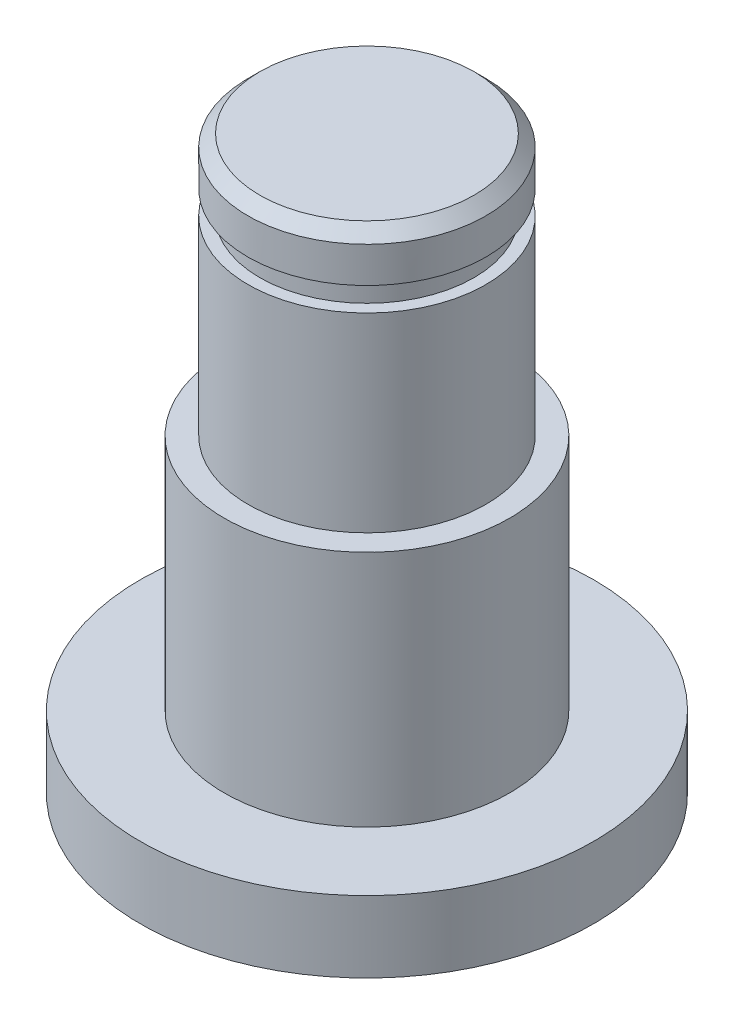
ISO-10303-21;
HEADER;
FILE_DESCRIPTION(('STEP AP214'),'2;1');
FILE_NAME('part.step','',(''),(''),'','','');
FILE_SCHEMA(('AUTOMOTIVE_DESIGN { 1 0 10303 214 1 1 1 1 }'));
ENDSEC;
DATA;
#1=APPLICATION_CONTEXT('core data for automotive mechanical design processes');
#2=APPLICATION_PROTOCOL_DEFINITION('international standard','automotive_design',2000,#1);
#3=PRODUCT_CONTEXT('',#1,'mechanical');
#4=PRODUCT('Part','Part','',(#3));
#5=PRODUCT_RELATED_PRODUCT_CATEGORY('part','',(#4));
#6=PRODUCT_DEFINITION_FORMATION('','',#4);
#7=PRODUCT_DEFINITION_CONTEXT('part definition',#1,'design');
#8=PRODUCT_DEFINITION('design','',#6,#7);
#9=PRODUCT_DEFINITION_SHAPE('','',#8);
#10=(LENGTH_UNIT() NAMED_UNIT(*) SI_UNIT(.MILLI.,.METRE.));
#11=(NAMED_UNIT(*) PLANE_ANGLE_UNIT() SI_UNIT($,.RADIAN.));
#12=(NAMED_UNIT(*) SI_UNIT($,.STERADIAN.) SOLID_ANGLE_UNIT());
#13=UNCERTAINTY_MEASURE_WITH_UNIT(LENGTH_MEASURE(1.E-05),#10,'distance_accuracy_value','');
#14=(GEOMETRIC_REPRESENTATION_CONTEXT(3) GLOBAL_UNCERTAINTY_ASSIGNED_CONTEXT((#13)) GLOBAL_UNIT_ASSIGNED_CONTEXT((#10,
#11,#12)) REPRESENTATION_CONTEXT('',''));
#15=CARTESIAN_POINT('',(0.,0.,0.));
#16=DIRECTION('',(0.,0.,1.));
#17=DIRECTION('',(1.,0.,0.));
#18=AXIS2_PLACEMENT_3D('',#15,#16,#17);
#19=CARTESIAN_POINT('',(0.,0.,0.));
#20=DIRECTION('',(0.,1.,0.));
#21=DIRECTION('',(0.,0.,1.));
#22=AXIS2_PLACEMENT_3D('',#19,#20,#21);
#23=PLANE('',#22);
#24=CARTESIAN_POINT('',(0.,0.,0.));
#25=DIRECTION('',(0.,-1.,0.));
#26=DIRECTION('',(0.,0.,-1.));
#27=AXIS2_PLACEMENT_3D('',#24,#25,#26);
#28=CIRCLE('',#27,9.525);
#29=CARTESIAN_POINT('',(0.,0.,-9.525));
#30=VERTEX_POINT('',#29);
#31=EDGE_CURVE('E46',#30,#30,#28,.T.);
#32=ORIENTED_EDGE('',*,*,#31,.T.);
#33=EDGE_LOOP('',(#32));
#34=FACE_BOUND('',#33,.T.);
#35=ADVANCED_FACE('F34',(#34),#23,.F.);
#36=CARTESIAN_POINT('',(0.,0.,0.));
#37=DIRECTION('',(0.,-1.,0.));
#38=DIRECTION('',(0.,0.,-1.));
#39=AXIS2_PLACEMENT_3D('',#36,#37,#38);
#40=CYLINDRICAL_SURFACE('',#39,9.525);
#41=ORIENTED_EDGE('',*,*,#31,.F.);
#42=EDGE_LOOP('',(#41));
#43=FACE_BOUND('',#42,.T.);
#44=CARTESIAN_POINT('',(0.,3.,0.));
#45=DIRECTION('',(0.,-1.,0.));
#46=DIRECTION('',(0.,0.,-1.));
#47=AXIS2_PLACEMENT_3D('',#44,#45,#46);
#48=CIRCLE('',#47,9.525);
#49=CARTESIAN_POINT('',(0.,3.,-9.525));
#50=VERTEX_POINT('',#49);
#51=EDGE_CURVE('E50',#50,#50,#48,.T.);
#52=ORIENTED_EDGE('',*,*,#51,.T.);
#53=EDGE_LOOP('',(#52));
#54=FACE_BOUND('',#53,.T.);
#55=ADVANCED_FACE('F108',(#43,#54),#40,.T.);
#56=CARTESIAN_POINT('',(-9.525,3.,0.));
#57=DIRECTION('',(0.,-1.,0.));
#58=DIRECTION('',(0.,0.,-1.));
#59=AXIS2_PLACEMENT_3D('',#56,#57,#58);
#60=PLANE('',#59);
#61=ORIENTED_EDGE('',*,*,#51,.F.);
#62=EDGE_LOOP('',(#61));
#63=FACE_BOUND('',#62,.T.);
#64=CARTESIAN_POINT('',(0.,3.,0.));
#65=DIRECTION('',(0.,-1.,0.));
#66=DIRECTION('',(0.,0.,-1.));
#67=AXIS2_PLACEMENT_3D('',#64,#65,#66);
#68=CIRCLE('',#67,6.);
#69=CARTESIAN_POINT('',(0.,3.,-6.));
#70=VERTEX_POINT('',#69);
#71=EDGE_CURVE('E63',#70,#70,#68,.T.);
#72=ORIENTED_EDGE('',*,*,#71,.T.);
#73=EDGE_LOOP('',(#72));
#74=FACE_BOUND('',#73,.T.);
#75=ADVANCED_FACE('F113',(#63,#74),#60,.F.);
#76=CARTESIAN_POINT('',(0.,0.,0.));
#77=DIRECTION('',(0.,-1.,0.));
#78=DIRECTION('',(0.,0.,-1.));
#79=AXIS2_PLACEMENT_3D('',#76,#77,#78);
#80=CYLINDRICAL_SURFACE('',#79,6.);
#81=ORIENTED_EDGE('',*,*,#71,.F.);
#82=EDGE_LOOP('',(#81));
#83=FACE_BOUND('',#82,.T.);
#84=CARTESIAN_POINT('',(0.,13.,0.));
#85=DIRECTION('',(0.,-1.,0.));
#86=DIRECTION('',(0.,0.,-1.));
#87=AXIS2_PLACEMENT_3D('',#84,#85,#86);
#88=CIRCLE('',#87,6.);
#89=CARTESIAN_POINT('',(0.,13.,-6.));
#90=VERTEX_POINT('',#89);
#91=EDGE_CURVE('E66',#90,#90,#88,.T.);
#92=ORIENTED_EDGE('',*,*,#91,.T.);
#93=EDGE_LOOP('',(#92));
#94=FACE_BOUND('',#93,.T.);
#95=ADVANCED_FACE('F119',(#83,#94),#80,.T.);
#96=CARTESIAN_POINT('',(-6.,13.,0.));
#97=DIRECTION('',(0.,-1.,0.));
#98=DIRECTION('',(0.,0.,-1.));
#99=AXIS2_PLACEMENT_3D('',#96,#97,#98);
#100=PLANE('',#99);
#101=ORIENTED_EDGE('',*,*,#91,.F.);
#102=EDGE_LOOP('',(#101));
#103=FACE_BOUND('',#102,.T.);
#104=CARTESIAN_POINT('',(0.,13.,0.));
#105=DIRECTION('',(0.,-1.,0.));
#106=DIRECTION('',(0.,0.,-1.));
#107=AXIS2_PLACEMENT_3D('',#104,#105,#106);
#108=CIRCLE('',#107,5.);
#109=CARTESIAN_POINT('',(0.,13.,-5.));
#110=VERTEX_POINT('',#109);
#111=EDGE_CURVE('E56',#110,#110,#108,.T.);
#112=ORIENTED_EDGE('',*,*,#111,.T.);
#113=EDGE_LOOP('',(#112));
#114=FACE_BOUND('',#113,.T.);
#115=ADVANCED_FACE('F105',(#103,#114),#100,.F.);
#116=CARTESIAN_POINT('',(0.,0.,0.));
#117=DIRECTION('',(0.,-1.,0.));
#118=DIRECTION('',(0.,0.,-1.));
#119=AXIS2_PLACEMENT_3D('',#116,#117,#118);
#120=CYLINDRICAL_SURFACE('',#119,5.);
#121=CARTESIAN_POINT('',(0.,21.,0.));
#122=DIRECTION('',(0.,-1.,0.));
#123=DIRECTION('',(0.,0.,-1.));
#124=AXIS2_PLACEMENT_3D('',#121,#122,#123);
#125=CIRCLE('',#124,5.);
#126=CARTESIAN_POINT('',(0.,21.,-5.));
#127=VERTEX_POINT('',#126);
#128=EDGE_CURVE('E57',#127,#127,#125,.T.);
#129=ORIENTED_EDGE('',*,*,#128,.T.);
#130=EDGE_LOOP('',(#129));
#131=FACE_BOUND('',#130,.T.);
#132=ORIENTED_EDGE('',*,*,#111,.F.);
#133=EDGE_LOOP('',(#132));
#134=FACE_BOUND('',#133,.T.);
#135=ADVANCED_FACE('F90',(#131,#134),#120,.T.);
#136=CARTESIAN_POINT('',(4.5,22.,0.));
#137=DIRECTION('',(0.,1.,0.));
#138=DIRECTION('',(0.,0.,1.));
#139=AXIS2_PLACEMENT_3D('',#136,#137,#138);
#140=PLANE('',#139);
#141=CARTESIAN_POINT('',(0.,22.,0.));
#142=DIRECTION('',(0.,-1.,0.));
#143=DIRECTION('',(0.,0.,-1.));
#144=AXIS2_PLACEMENT_3D('',#141,#142,#143);
#145=CIRCLE('',#144,4.5);
#146=CARTESIAN_POINT('',(0.,22.,-4.5));
#147=VERTEX_POINT('',#146);
#148=EDGE_CURVE('E59',#147,#147,#145,.T.);
#149=ORIENTED_EDGE('',*,*,#148,.F.);
#150=EDGE_LOOP('',(#149));
#151=FACE_BOUND('',#150,.T.);
#152=CARTESIAN_POINT('',(0.,22.,0.));
#153=DIRECTION('',(0.,1.,0.));
#154=DIRECTION('',(0.,0.,1.));
#155=AXIS2_PLACEMENT_3D('',#152,#153,#154);
#156=CIRCLE('',#155,5.);
#157=CARTESIAN_POINT('',(0.,22.,5.));
#158=VERTEX_POINT('',#157);
#159=EDGE_CURVE('E53',#158,#158,#156,.T.);
#160=ORIENTED_EDGE('',*,*,#159,.F.);
#161=EDGE_LOOP('',(#160));
#162=FACE_BOUND('',#161,.T.);
#163=ADVANCED_FACE('F87',(#151,#162),#140,.F.);
#164=CARTESIAN_POINT('',(4.5,21.,0.));
#165=DIRECTION('',(0.,-1.,0.));
#166=DIRECTION('',(0.,0.,-1.));
#167=AXIS2_PLACEMENT_3D('',#164,#165,#166);
#168=PLANE('',#167);
#169=CARTESIAN_POINT('',(0.,21.,0.));
#170=DIRECTION('',(0.,-1.,0.));
#171=DIRECTION('',(0.,0.,-1.));
#172=AXIS2_PLACEMENT_3D('',#169,#170,#171);
#173=CIRCLE('',#172,4.5);
#174=CARTESIAN_POINT('',(0.,21.,-4.5));
#175=VERTEX_POINT('',#174);
#176=EDGE_CURVE('E73',#175,#175,#173,.T.);
#177=ORIENTED_EDGE('',*,*,#176,.T.);
#178=EDGE_LOOP('',(#177));
#179=FACE_BOUND('',#178,.T.);
#180=ORIENTED_EDGE('',*,*,#128,.F.);
#181=EDGE_LOOP('',(#180));
#182=FACE_BOUND('',#181,.T.);
#183=ADVANCED_FACE('F77',(#179,#182),#168,.F.);
#184=CARTESIAN_POINT('',(0.,0.,0.));
#185=DIRECTION('',(0.,-1.,0.));
#186=DIRECTION('',(0.,0.,-1.));
#187=AXIS2_PLACEMENT_3D('',#184,#185,#186);
#188=CYLINDRICAL_SURFACE('',#187,4.5);
#189=ORIENTED_EDGE('',*,*,#176,.F.);
#190=EDGE_LOOP('',(#189));
#191=FACE_BOUND('',#190,.T.);
#192=ORIENTED_EDGE('',*,*,#148,.T.);
#193=EDGE_LOOP('',(#192));
#194=FACE_BOUND('',#193,.T.);
#195=ADVANCED_FACE('F80',(#191,#194),#188,.T.);
#196=CARTESIAN_POINT('',(-5.,24.,0.));
#197=DIRECTION('',(0.,-1.,0.));
#198=DIRECTION('',(0.,0.,-1.));
#199=AXIS2_PLACEMENT_3D('',#196,#197,#198);
#200=PLANE('',#199);
#201=CARTESIAN_POINT('',(0.,24.,0.));
#202=DIRECTION('',(0.,-1.,0.));
#203=DIRECTION('',(0.,0.,-1.));
#204=AXIS2_PLACEMENT_3D('',#201,#202,#203);
#205=CIRCLE('',#204,4.5);
#206=CARTESIAN_POINT('',(0.,24.,-4.5));
#207=VERTEX_POINT('',#206);
#208=EDGE_CURVE('E10',#207,#207,#205,.F.);
#209=ORIENTED_EDGE('',*,*,#208,.T.);
#210=EDGE_LOOP('',(#209));
#211=FACE_BOUND('',#210,.T.);
#212=ADVANCED_FACE('F83',(#211),#200,.F.);
#213=CARTESIAN_POINT('',(0.,23.5,0.));
#214=DIRECTION('',(0.,-1.,0.));
#215=DIRECTION('',(0.,0.,-1.));
#216=AXIS2_PLACEMENT_3D('',#213,#214,#215);
#217=CIRCLE('',#216,5.);
#218=CARTESIAN_POINT('',(0.,23.5,-5.));
#219=VERTEX_POINT('',#218);
#220=EDGE_CURVE('E42',#219,#219,#217,.T.);
#221=ORIENTED_EDGE('',*,*,#220,.T.);
#222=EDGE_LOOP('',(#221));
#223=FACE_BOUND('',#222,.T.);
#224=ORIENTED_EDGE('',*,*,#159,.T.);
#225=EDGE_LOOP('',(#224));
#226=FACE_BOUND('',#225,.T.);
#227=ADVANCED_FACE('F94',(#223,#226),#120,.T.);
#228=CARTESIAN_POINT('',(0.,23.5,0.));
#229=DIRECTION('',(0.,-1.,0.));
#230=DIRECTION('',(0.,0.,-1.));
#231=AXIS2_PLACEMENT_3D('',#228,#229,#230);
#232=CONICAL_SURFACE('',#231,5.,0.785398163397454);
#233=ORIENTED_EDGE('',*,*,#208,.F.);
#234=EDGE_LOOP('',(#233));
#235=FACE_BOUND('',#234,.T.);
#236=ORIENTED_EDGE('',*,*,#220,.F.);
#237=EDGE_LOOP('',(#236));
#238=FACE_BOUND('',#237,.T.);
#239=ADVANCED_FACE('F37',(#235,#238),#232,.T.);
#240=CLOSED_SHELL('',(#35,#55,#75,#95,#115,#135,#163,#183,#195,#212,#227,#239));
#241=MANIFOLD_SOLID_BREP('B2',#240);
#242=ADVANCED_BREP_SHAPE_REPRESENTATION('',(#18,#241),#14);
#243=SHAPE_DEFINITION_REPRESENTATION(#9,#242);
ENDSEC;
END-ISO-10303-21;
